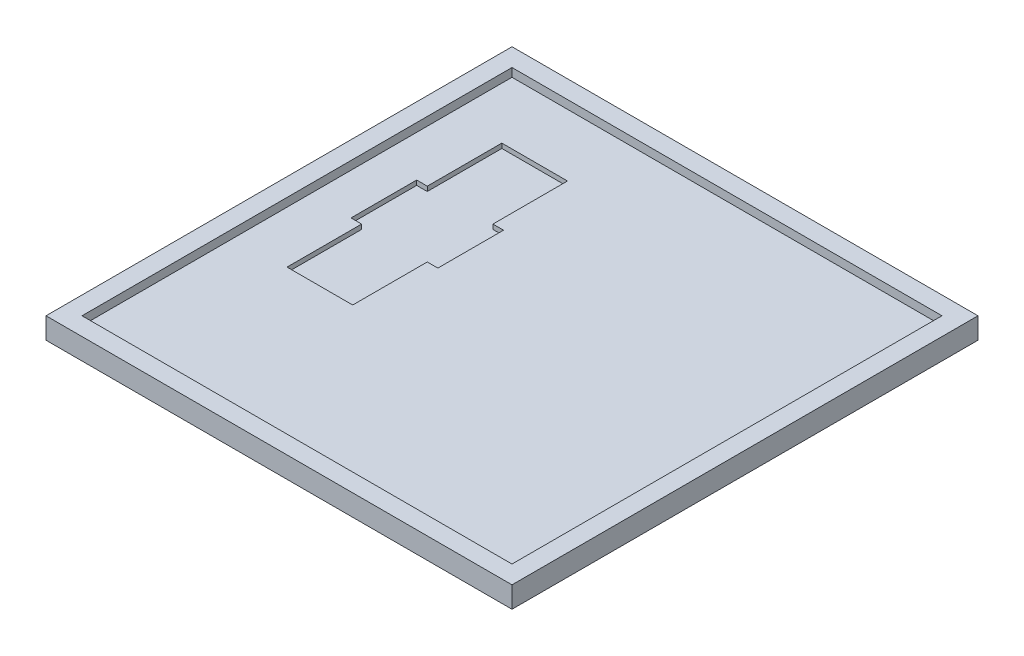
ISO-10303-21;
HEADER;
FILE_DESCRIPTION(('STEP AP214'),'2;1');
FILE_NAME('part.step','',(''),(''),'','','');
FILE_SCHEMA(('AUTOMOTIVE_DESIGN { 1 0 10303 214 1 1 1 1 }'));
ENDSEC;
DATA;
#1=APPLICATION_CONTEXT('core data for automotive mechanical design processes');
#2=APPLICATION_PROTOCOL_DEFINITION('international standard','automotive_design',2000,#1);
#3=PRODUCT_CONTEXT('',#1,'mechanical');
#4=PRODUCT('Part','Part','',(#3));
#5=PRODUCT_RELATED_PRODUCT_CATEGORY('part','',(#4));
#6=PRODUCT_DEFINITION_FORMATION('','',#4);
#7=PRODUCT_DEFINITION_CONTEXT('part definition',#1,'design');
#8=PRODUCT_DEFINITION('design','',#6,#7);
#9=PRODUCT_DEFINITION_SHAPE('','',#8);
#10=(LENGTH_UNIT() NAMED_UNIT(*) SI_UNIT(.MILLI.,.METRE.));
#11=(NAMED_UNIT(*) PLANE_ANGLE_UNIT() SI_UNIT($,.RADIAN.));
#12=(NAMED_UNIT(*) SI_UNIT($,.STERADIAN.) SOLID_ANGLE_UNIT());
#13=UNCERTAINTY_MEASURE_WITH_UNIT(LENGTH_MEASURE(1.E-05),#10,'distance_accuracy_value','');
#14=(GEOMETRIC_REPRESENTATION_CONTEXT(3) GLOBAL_UNCERTAINTY_ASSIGNED_CONTEXT((#13)) GLOBAL_UNIT_ASSIGNED_CONTEXT((#10,
#11,#12)) REPRESENTATION_CONTEXT('',''));
#15=CARTESIAN_POINT('',(0.,0.,0.));
#16=DIRECTION('',(0.,0.,1.));
#17=DIRECTION('',(1.,0.,0.));
#18=AXIS2_PLACEMENT_3D('',#15,#16,#17);
#19=CARTESIAN_POINT('',(-68.8630136986301,5.,-38.3493150684931));
#20=DIRECTION('',(1.,0.,0.));
#21=DIRECTION('',(0.,0.,-1.));
#22=AXIS2_PLACEMENT_3D('',#19,#20,#21);
#23=PLANE('',#22);
#24=DIRECTION('',(0.,0.,1.));
#25=VECTOR('',#24,1.);
#26=CARTESIAN_POINT('',(-68.8630136986301,0.,-38.3493150684931));
#27=LINE('',#26,#25);
#28=CARTESIAN_POINT('',(-68.8630136986301,0.,-38.3493150684931));
#29=VERTEX_POINT('',#28);
#30=CARTESIAN_POINT('',(-68.8630136986301,0.,71.6506849315068));
#31=VERTEX_POINT('',#30);
#32=EDGE_CURVE('E296',#29,#31,#27,.T.);
#33=ORIENTED_EDGE('',*,*,#32,.T.);
#34=DIRECTION('',(0.,-1.,0.));
#35=VECTOR('',#34,1.);
#36=CARTESIAN_POINT('',(-68.8630136986301,5.,71.6506849315068));
#37=LINE('',#36,#35);
#38=CARTESIAN_POINT('',(-68.8630136986301,5.,71.6506849315068));
#39=VERTEX_POINT('',#38);
#40=EDGE_CURVE('E11',#39,#31,#37,.T.);
#41=ORIENTED_EDGE('',*,*,#40,.F.);
#42=DIRECTION('',(0.,0.,1.));
#43=VECTOR('',#42,1.);
#44=CARTESIAN_POINT('',(-68.8630136986301,5.,-38.3493150684931));
#45=LINE('',#44,#43);
#46=CARTESIAN_POINT('',(-68.8630136986301,5.,-38.3493150684931));
#47=VERTEX_POINT('',#46);
#48=EDGE_CURVE('E302',#47,#39,#45,.T.);
#49=ORIENTED_EDGE('',*,*,#48,.F.);
#50=DIRECTION('',(0.,-1.,0.));
#51=VECTOR('',#50,1.);
#52=CARTESIAN_POINT('',(-68.8630136986301,5.,-38.3493150684931));
#53=LINE('',#52,#51);
#54=EDGE_CURVE('E312',#47,#29,#53,.T.);
#55=ORIENTED_EDGE('',*,*,#54,.T.);
#56=EDGE_LOOP('',(#33,#41,#49,#55));
#57=FACE_BOUND('',#56,.T.);
#58=ADVANCED_FACE('F33',(#57),#23,.F.);
#59=CARTESIAN_POINT('',(-68.8630136986301,5.,71.6506849315068));
#60=DIRECTION('',(0.,0.,-1.));
#61=DIRECTION('',(-1.,0.,0.));
#62=AXIS2_PLACEMENT_3D('',#59,#60,#61);
#63=PLANE('',#62);
#64=DIRECTION('',(1.,0.,0.));
#65=VECTOR('',#64,1.);
#66=CARTESIAN_POINT('',(-68.8630136986301,0.,71.6506849315068));
#67=LINE('',#66,#65);
#68=CARTESIAN_POINT('',(41.1369863013699,0.,71.6506849315068));
#69=VERTEX_POINT('',#68);
#70=EDGE_CURVE('E315',#31,#69,#67,.T.);
#71=ORIENTED_EDGE('',*,*,#70,.T.);
#72=DIRECTION('',(0.,-1.,0.));
#73=VECTOR('',#72,1.);
#74=CARTESIAN_POINT('',(41.1369863013699,5.,71.6506849315068));
#75=LINE('',#74,#73);
#76=CARTESIAN_POINT('',(41.1369863013699,5.,71.6506849315068));
#77=VERTEX_POINT('',#76);
#78=EDGE_CURVE('E40',#77,#69,#75,.T.);
#79=ORIENTED_EDGE('',*,*,#78,.F.);
#80=DIRECTION('',(1.,0.,0.));
#81=VECTOR('',#80,1.);
#82=CARTESIAN_POINT('',(-68.8630136986301,5.,71.6506849315068));
#83=LINE('',#82,#81);
#84=EDGE_CURVE('E305',#39,#77,#83,.T.);
#85=ORIENTED_EDGE('',*,*,#84,.F.);
#86=ORIENTED_EDGE('',*,*,#40,.T.);
#87=EDGE_LOOP('',(#71,#79,#85,#86));
#88=FACE_BOUND('',#87,.T.);
#89=ADVANCED_FACE('F345',(#88),#63,.F.);
#90=CARTESIAN_POINT('',(41.1369863013699,5.,-38.3493150684931));
#91=DIRECTION('',(-1.,0.,0.));
#92=DIRECTION('',(0.,0.,1.));
#93=AXIS2_PLACEMENT_3D('',#90,#91,#92);
#94=PLANE('',#93);
#95=DIRECTION('',(0.,0.,-1.));
#96=VECTOR('',#95,1.);
#97=CARTESIAN_POINT('',(41.1369863013699,0.,-38.3493150684931));
#98=LINE('',#97,#96);
#99=CARTESIAN_POINT('',(41.1369863013699,0.,-38.3493150684931));
#100=VERTEX_POINT('',#99);
#101=EDGE_CURVE('E317',#69,#100,#98,.T.);
#102=ORIENTED_EDGE('',*,*,#101,.T.);
#103=DIRECTION('',(0.,-1.,0.));
#104=VECTOR('',#103,1.);
#105=CARTESIAN_POINT('',(41.1369863013699,5.,-38.3493150684931));
#106=LINE('',#105,#104);
#107=CARTESIAN_POINT('',(41.1369863013699,5.,-38.3493150684931));
#108=VERTEX_POINT('',#107);
#109=EDGE_CURVE('E322',#108,#100,#106,.T.);
#110=ORIENTED_EDGE('',*,*,#109,.F.);
#111=DIRECTION('',(0.,0.,-1.));
#112=VECTOR('',#111,1.);
#113=CARTESIAN_POINT('',(41.1369863013699,5.,-38.3493150684931));
#114=LINE('',#113,#112);
#115=EDGE_CURVE('E308',#77,#108,#114,.T.);
#116=ORIENTED_EDGE('',*,*,#115,.F.);
#117=ORIENTED_EDGE('',*,*,#78,.T.);
#118=EDGE_LOOP('',(#102,#110,#116,#117));
#119=FACE_BOUND('',#118,.T.);
#120=ADVANCED_FACE('F329',(#119),#94,.F.);
#121=CARTESIAN_POINT('',(-68.8630136986301,5.,-38.3493150684931));
#122=DIRECTION('',(0.,0.,1.));
#123=DIRECTION('',(1.,0.,0.));
#124=AXIS2_PLACEMENT_3D('',#121,#122,#123);
#125=PLANE('',#124);
#126=DIRECTION('',(-1.,0.,0.));
#127=VECTOR('',#126,1.);
#128=CARTESIAN_POINT('',(-68.8630136986301,0.,-38.3493150684931));
#129=LINE('',#128,#127);
#130=EDGE_CURVE('E306',#100,#29,#129,.T.);
#131=ORIENTED_EDGE('',*,*,#130,.T.);
#132=ORIENTED_EDGE('',*,*,#54,.F.);
#133=DIRECTION('',(-1.,0.,0.));
#134=VECTOR('',#133,1.);
#135=CARTESIAN_POINT('',(-68.8630136986301,5.,-38.3493150684931));
#136=LINE('',#135,#134);
#137=EDGE_CURVE('E310',#108,#47,#136,.T.);
#138=ORIENTED_EDGE('',*,*,#137,.F.);
#139=ORIENTED_EDGE('',*,*,#109,.T.);
#140=EDGE_LOOP('',(#131,#132,#138,#139));
#141=FACE_BOUND('',#140,.T.);
#142=ADVANCED_FACE('F338',(#141),#125,.F.);
#143=CARTESIAN_POINT('',(0.,5.,0.));
#144=DIRECTION('',(0.,1.,0.));
#145=DIRECTION('',(0.,0.,1.));
#146=AXIS2_PLACEMENT_3D('',#143,#144,#145);
#147=PLANE('',#146);
#148=DIRECTION('',(0.,0.,1.));
#149=VECTOR('',#148,1.);
#150=CARTESIAN_POINT('',(-64.6130136986301,5.,-34.0993150684931));
#151=LINE('',#150,#149);
#152=CARTESIAN_POINT('',(-64.6130136986301,5.,-34.0993150684931));
#153=VERTEX_POINT('',#152);
#154=CARTESIAN_POINT('',(-64.6130136986301,5.,67.4006849315068));
#155=VERTEX_POINT('',#154);
#156=EDGE_CURVE('E55',#153,#155,#151,.T.);
#157=ORIENTED_EDGE('',*,*,#156,.F.);
#158=DIRECTION('',(-1.,0.,0.));
#159=VECTOR('',#158,1.);
#160=CARTESIAN_POINT('',(-64.6130136986301,5.,-34.0993150684931));
#161=LINE('',#160,#159);
#162=CARTESIAN_POINT('',(36.8869863013699,5.,-34.0993150684932));
#163=VERTEX_POINT('',#162);
#164=EDGE_CURVE('E275',#163,#153,#161,.T.);
#165=ORIENTED_EDGE('',*,*,#164,.F.);
#166=DIRECTION('',(0.,0.,-1.));
#167=VECTOR('',#166,1.);
#168=CARTESIAN_POINT('',(36.8869863013699,5.,-34.0993150684932));
#169=LINE('',#168,#167);
#170=CARTESIAN_POINT('',(36.8869863013699,5.,67.4006849315068));
#171=VERTEX_POINT('',#170);
#172=EDGE_CURVE('E289',#171,#163,#169,.T.);
#173=ORIENTED_EDGE('',*,*,#172,.F.);
#174=DIRECTION('',(1.,0.,0.));
#175=VECTOR('',#174,1.);
#176=CARTESIAN_POINT('',(-64.6130136986301,5.,67.4006849315068));
#177=LINE('',#176,#175);
#178=EDGE_CURVE('E286',#155,#171,#177,.T.);
#179=ORIENTED_EDGE('',*,*,#178,.F.);
#180=EDGE_LOOP('',(#157,#165,#173,#179));
#181=FACE_BOUND('',#180,.T.);
#182=ORIENTED_EDGE('',*,*,#48,.T.);
#183=ORIENTED_EDGE('',*,*,#84,.T.);
#184=ORIENTED_EDGE('',*,*,#115,.T.);
#185=ORIENTED_EDGE('',*,*,#137,.T.);
#186=EDGE_LOOP('',(#182,#183,#184,#185));
#187=FACE_BOUND('',#186,.T.);
#188=ADVANCED_FACE('F344',(#181,#187),#147,.T.);
#189=CARTESIAN_POINT('',(0.,0.,0.));
#190=DIRECTION('',(0.,1.,0.));
#191=DIRECTION('',(0.,0.,1.));
#192=AXIS2_PLACEMENT_3D('',#189,#190,#191);
#193=PLANE('',#192);
#194=ORIENTED_EDGE('',*,*,#32,.F.);
#195=ORIENTED_EDGE('',*,*,#130,.F.);
#196=ORIENTED_EDGE('',*,*,#101,.F.);
#197=ORIENTED_EDGE('',*,*,#70,.F.);
#198=EDGE_LOOP('',(#194,#195,#196,#197));
#199=FACE_BOUND('',#198,.T.);
#200=ADVANCED_FACE('F335',(#199),#193,.F.);
#201=CARTESIAN_POINT('',(-64.6130136986301,3.,-34.0993150684931));
#202=DIRECTION('',(-1.,0.,0.));
#203=DIRECTION('',(0.,0.,1.));
#204=AXIS2_PLACEMENT_3D('',#201,#202,#203);
#205=PLANE('',#204);
#206=ORIENTED_EDGE('',*,*,#156,.T.);
#207=DIRECTION('',(0.,1.,0.));
#208=VECTOR('',#207,1.);
#209=CARTESIAN_POINT('',(-64.6130136986301,3.,67.4006849315068));
#210=LINE('',#209,#208);
#211=CARTESIAN_POINT('',(-64.6130136986301,3.,67.4006849315068));
#212=VERTEX_POINT('',#211);
#213=EDGE_CURVE('E284',#212,#155,#210,.T.);
#214=ORIENTED_EDGE('',*,*,#213,.F.);
#215=DIRECTION('',(0.,0.,1.));
#216=VECTOR('',#215,1.);
#217=CARTESIAN_POINT('',(-64.6130136986301,3.,-34.0993150684931));
#218=LINE('',#217,#216);
#219=CARTESIAN_POINT('',(-64.6130136986301,3.,-34.0993150684931));
#220=VERTEX_POINT('',#219);
#221=EDGE_CURVE('E271',#220,#212,#218,.T.);
#222=ORIENTED_EDGE('',*,*,#221,.F.);
#223=DIRECTION('',(0.,1.,0.));
#224=VECTOR('',#223,1.);
#225=CARTESIAN_POINT('',(-64.6130136986301,3.,-34.0993150684931));
#226=LINE('',#225,#224);
#227=EDGE_CURVE('E294',#220,#153,#226,.T.);
#228=ORIENTED_EDGE('',*,*,#227,.T.);
#229=EDGE_LOOP('',(#206,#214,#222,#228));
#230=FACE_BOUND('',#229,.T.);
#231=ADVANCED_FACE('F357',(#230),#205,.F.);
#232=CARTESIAN_POINT('',(-64.6130136986301,3.,-34.0993150684931));
#233=DIRECTION('',(0.,0.,-1.));
#234=DIRECTION('',(-1.,0.,0.));
#235=AXIS2_PLACEMENT_3D('',#232,#233,#234);
#236=PLANE('',#235);
#237=ORIENTED_EDGE('',*,*,#164,.T.);
#238=ORIENTED_EDGE('',*,*,#227,.F.);
#239=DIRECTION('',(-1.,0.,0.));
#240=VECTOR('',#239,1.);
#241=CARTESIAN_POINT('',(-64.6130136986301,3.,-34.0993150684931));
#242=LINE('',#241,#240);
#243=CARTESIAN_POINT('',(36.8869863013699,3.,-34.0993150684932));
#244=VERTEX_POINT('',#243);
#245=EDGE_CURVE('E281',#244,#220,#242,.T.);
#246=ORIENTED_EDGE('',*,*,#245,.F.);
#247=DIRECTION('',(0.,1.,0.));
#248=VECTOR('',#247,1.);
#249=CARTESIAN_POINT('',(36.8869863013699,3.,-34.0993150684932));
#250=LINE('',#249,#248);
#251=EDGE_CURVE('E297',#244,#163,#250,.T.);
#252=ORIENTED_EDGE('',*,*,#251,.T.);
#253=EDGE_LOOP('',(#237,#238,#246,#252));
#254=FACE_BOUND('',#253,.T.);
#255=ADVANCED_FACE('F363',(#254),#236,.F.);
#256=CARTESIAN_POINT('',(36.8869863013699,3.,-34.0993150684932));
#257=DIRECTION('',(1.,0.,0.));
#258=DIRECTION('',(0.,0.,-1.));
#259=AXIS2_PLACEMENT_3D('',#256,#257,#258);
#260=PLANE('',#259);
#261=ORIENTED_EDGE('',*,*,#172,.T.);
#262=ORIENTED_EDGE('',*,*,#251,.F.);
#263=DIRECTION('',(0.,0.,-1.));
#264=VECTOR('',#263,1.);
#265=CARTESIAN_POINT('',(36.8869863013699,3.,-34.0993150684932));
#266=LINE('',#265,#264);
#267=CARTESIAN_POINT('',(36.8869863013699,3.,67.4006849315068));
#268=VERTEX_POINT('',#267);
#269=EDGE_CURVE('E278',#268,#244,#266,.T.);
#270=ORIENTED_EDGE('',*,*,#269,.F.);
#271=DIRECTION('',(0.,1.,0.));
#272=VECTOR('',#271,1.);
#273=CARTESIAN_POINT('',(36.8869863013699,3.,67.4006849315068));
#274=LINE('',#273,#272);
#275=EDGE_CURVE('E299',#268,#171,#274,.T.);
#276=ORIENTED_EDGE('',*,*,#275,.T.);
#277=EDGE_LOOP('',(#261,#262,#270,#276));
#278=FACE_BOUND('',#277,.T.);
#279=ADVANCED_FACE('F368',(#278),#260,.F.);
#280=CARTESIAN_POINT('',(-64.6130136986301,3.,67.4006849315068));
#281=DIRECTION('',(0.,0.,1.));
#282=DIRECTION('',(1.,0.,0.));
#283=AXIS2_PLACEMENT_3D('',#280,#281,#282);
#284=PLANE('',#283);
#285=ORIENTED_EDGE('',*,*,#178,.T.);
#286=ORIENTED_EDGE('',*,*,#275,.F.);
#287=DIRECTION('',(1.,0.,0.));
#288=VECTOR('',#287,1.);
#289=CARTESIAN_POINT('',(-64.6130136986301,3.,67.4006849315068));
#290=LINE('',#289,#288);
#291=EDGE_CURVE('E274',#212,#268,#290,.T.);
#292=ORIENTED_EDGE('',*,*,#291,.F.);
#293=ORIENTED_EDGE('',*,*,#213,.T.);
#294=EDGE_LOOP('',(#285,#286,#292,#293));
#295=FACE_BOUND('',#294,.T.);
#296=ADVANCED_FACE('F364',(#295),#284,.F.);
#297=CARTESIAN_POINT('',(0.,3.,0.));
#298=DIRECTION('',(0.,1.,0.));
#299=DIRECTION('',(0.,0.,1.));
#300=AXIS2_PLACEMENT_3D('',#297,#298,#299);
#301=PLANE('',#300);
#302=DIRECTION('',(0.,0.,-1.));
#303=VECTOR('',#302,1.);
#304=CARTESIAN_POINT('',(-34.3630136986301,3.,-1.84931506849316));
#305=LINE('',#304,#303);
#306=CARTESIAN_POINT('',(-34.3630136986301,3.,13.6506849315068));
#307=VERTEX_POINT('',#306);
#308=CARTESIAN_POINT('',(-34.3630136986301,3.,-1.84931506849316));
#309=VERTEX_POINT('',#308);
#310=EDGE_CURVE('E47',#307,#309,#305,.T.);
#311=ORIENTED_EDGE('',*,*,#310,.F.);
#312=DIRECTION('',(1.,0.,0.));
#313=VECTOR('',#312,1.);
#314=CARTESIAN_POINT('',(-34.3630136986301,3.,13.6506849315068));
#315=LINE('',#314,#313);
#316=CARTESIAN_POINT('',(-36.8630136986301,3.,13.6506849315068));
#317=VERTEX_POINT('',#316);
#318=EDGE_CURVE('E190',#317,#307,#315,.T.);
#319=ORIENTED_EDGE('',*,*,#318,.F.);
#320=DIRECTION('',(0.,0.,-1.));
#321=VECTOR('',#320,1.);
#322=CARTESIAN_POINT('',(-36.8630136986301,3.,13.6506849315068));
#323=LINE('',#322,#321);
#324=CARTESIAN_POINT('',(-36.8630136986301,3.,31.2506849315068));
#325=VERTEX_POINT('',#324);
#326=EDGE_CURVE('E193',#325,#317,#323,.T.);
#327=ORIENTED_EDGE('',*,*,#326,.F.);
#328=DIRECTION('',(1.,0.,0.));
#329=VECTOR('',#328,1.);
#330=CARTESIAN_POINT('',(-52.3630136986301,3.,31.2506849315069));
#331=LINE('',#330,#329);
#332=CARTESIAN_POINT('',(-52.3630136986301,3.,31.2506849315069));
#333=VERTEX_POINT('',#332);
#334=EDGE_CURVE('E245',#333,#325,#331,.T.);
#335=ORIENTED_EDGE('',*,*,#334,.F.);
#336=DIRECTION('',(0.,0.,1.));
#337=VECTOR('',#336,1.);
#338=CARTESIAN_POINT('',(-52.3630136986301,3.,13.6506849315068));
#339=LINE('',#338,#337);
#340=CARTESIAN_POINT('',(-52.3630136986301,3.,13.6506849315068));
#341=VERTEX_POINT('',#340);
#342=EDGE_CURVE('E242',#341,#333,#339,.T.);
#343=ORIENTED_EDGE('',*,*,#342,.F.);
#344=DIRECTION('',(1.,0.,0.));
#345=VECTOR('',#344,1.);
#346=CARTESIAN_POINT('',(-52.3630136986301,3.,13.6506849315068));
#347=LINE('',#346,#345);
#348=CARTESIAN_POINT('',(-54.8630136986301,3.,13.6506849315068));
#349=VERTEX_POINT('',#348);
#350=EDGE_CURVE('E239',#349,#341,#347,.T.);
#351=ORIENTED_EDGE('',*,*,#350,.F.);
#352=DIRECTION('',(0.,0.,1.));
#353=VECTOR('',#352,1.);
#354=CARTESIAN_POINT('',(-54.8630136986301,3.,-1.84931506849315));
#355=LINE('',#354,#353);
#356=CARTESIAN_POINT('',(-54.8630136986301,3.,-1.84931506849315));
#357=VERTEX_POINT('',#356);
#358=EDGE_CURVE('E236',#357,#349,#355,.T.);
#359=ORIENTED_EDGE('',*,*,#358,.F.);
#360=DIRECTION('',(-1.,0.,0.));
#361=VECTOR('',#360,1.);
#362=CARTESIAN_POINT('',(-52.3630136986301,3.,-1.84931506849315));
#363=LINE('',#362,#361);
#364=CARTESIAN_POINT('',(-52.3630136986301,3.,-1.84931506849315));
#365=VERTEX_POINT('',#364);
#366=EDGE_CURVE('E233',#365,#357,#363,.T.);
#367=ORIENTED_EDGE('',*,*,#366,.F.);
#368=DIRECTION('',(0.,0.,1.));
#369=VECTOR('',#368,1.);
#370=CARTESIAN_POINT('',(-52.3630136986301,3.,-19.4493150684931));
#371=LINE('',#370,#369);
#372=CARTESIAN_POINT('',(-52.3630136986301,3.,-19.4493150684931));
#373=VERTEX_POINT('',#372);
#374=EDGE_CURVE('E230',#373,#365,#371,.T.);
#375=ORIENTED_EDGE('',*,*,#374,.F.);
#376=DIRECTION('',(-1.,0.,0.));
#377=VECTOR('',#376,1.);
#378=CARTESIAN_POINT('',(-52.3630136986301,3.,-19.4493150684931));
#379=LINE('',#378,#377);
#380=CARTESIAN_POINT('',(-36.8630136986301,3.,-19.4493150684931));
#381=VERTEX_POINT('',#380);
#382=EDGE_CURVE('E227',#381,#373,#379,.T.);
#383=ORIENTED_EDGE('',*,*,#382,.F.);
#384=DIRECTION('',(0.,0.,-1.));
#385=VECTOR('',#384,1.);
#386=CARTESIAN_POINT('',(-36.8630136986301,3.,-19.4493150684931));
#387=LINE('',#386,#385);
#388=CARTESIAN_POINT('',(-36.8630136986301,3.,-1.84931506849316));
#389=VERTEX_POINT('',#388);
#390=EDGE_CURVE('E224',#389,#381,#387,.T.);
#391=ORIENTED_EDGE('',*,*,#390,.F.);
#392=DIRECTION('',(-1.,0.,0.));
#393=VECTOR('',#392,1.);
#394=CARTESIAN_POINT('',(-34.3630136986301,3.,-1.84931506849316));
#395=LINE('',#394,#393);
#396=EDGE_CURVE('E222',#309,#389,#395,.T.);
#397=ORIENTED_EDGE('',*,*,#396,.F.);
#398=EDGE_LOOP('',(#311,#319,#327,#335,#343,#351,#359,#367,#375,#383,#391,#397));
#399=FACE_BOUND('',#398,.T.);
#400=ORIENTED_EDGE('',*,*,#221,.T.);
#401=ORIENTED_EDGE('',*,*,#291,.T.);
#402=ORIENTED_EDGE('',*,*,#269,.T.);
#403=ORIENTED_EDGE('',*,*,#245,.T.);
#404=EDGE_LOOP('',(#400,#401,#402,#403));
#405=FACE_BOUND('',#404,.T.);
#406=ADVANCED_FACE('F367',(#399,#405),#301,.T.);
#407=CARTESIAN_POINT('',(-34.3630136986301,1.9,-1.84931506849316));
#408=DIRECTION('',(1.,0.,0.));
#409=DIRECTION('',(0.,0.,-1.));
#410=AXIS2_PLACEMENT_3D('',#407,#408,#409);
#411=PLANE('',#410);
#412=ORIENTED_EDGE('',*,*,#310,.T.);
#413=DIRECTION('',(0.,1.,0.));
#414=VECTOR('',#413,1.);
#415=CARTESIAN_POINT('',(-34.3630136986301,1.9,-1.84931506849316));
#416=LINE('',#415,#414);
#417=CARTESIAN_POINT('',(-34.3630136986301,1.9,-1.84931506849316));
#418=VERTEX_POINT('',#417);
#419=EDGE_CURVE('E167',#418,#309,#416,.T.);
#420=ORIENTED_EDGE('',*,*,#419,.F.);
#421=DIRECTION('',(0.,0.,-1.));
#422=VECTOR('',#421,1.);
#423=CARTESIAN_POINT('',(-34.3630136986301,1.9,-1.84931506849316));
#424=LINE('',#423,#422);
#425=CARTESIAN_POINT('',(-34.3630136986301,1.9,13.6506849315068));
#426=VERTEX_POINT('',#425);
#427=EDGE_CURVE('E171',#426,#418,#424,.T.);
#428=ORIENTED_EDGE('',*,*,#427,.F.);
#429=DIRECTION('',(0.,1.,0.));
#430=VECTOR('',#429,1.);
#431=CARTESIAN_POINT('',(-34.3630136986301,1.9,13.6506849315068));
#432=LINE('',#431,#430);
#433=EDGE_CURVE('E250',#426,#307,#432,.T.);
#434=ORIENTED_EDGE('',*,*,#433,.T.);
#435=EDGE_LOOP('',(#412,#420,#428,#434));
#436=FACE_BOUND('',#435,.T.);
#437=ADVANCED_FACE('F169',(#436),#411,.F.);
#438=CARTESIAN_POINT('',(-34.3630136986301,1.9,13.6506849315068));
#439=DIRECTION('',(0.,0.,1.));
#440=DIRECTION('',(1.,0.,0.));
#441=AXIS2_PLACEMENT_3D('',#438,#439,#440);
#442=PLANE('',#441);
#443=ORIENTED_EDGE('',*,*,#318,.T.);
#444=ORIENTED_EDGE('',*,*,#433,.F.);
#445=DIRECTION('',(1.,0.,0.));
#446=VECTOR('',#445,1.);
#447=CARTESIAN_POINT('',(-34.3630136986301,1.9,13.6506849315068));
#448=LINE('',#447,#446);
#449=CARTESIAN_POINT('',(-36.8630136986301,1.9,13.6506849315068));
#450=VERTEX_POINT('',#449);
#451=EDGE_CURVE('E177',#450,#426,#448,.T.);
#452=ORIENTED_EDGE('',*,*,#451,.F.);
#453=DIRECTION('',(0.,1.,0.));
#454=VECTOR('',#453,1.);
#455=CARTESIAN_POINT('',(-36.8630136986301,1.9,13.6506849315068));
#456=LINE('',#455,#454);
#457=EDGE_CURVE('E252',#450,#317,#456,.T.);
#458=ORIENTED_EDGE('',*,*,#457,.T.);
#459=EDGE_LOOP('',(#443,#444,#452,#458));
#460=FACE_BOUND('',#459,.T.);
#461=ADVANCED_FACE('F381',(#460),#442,.F.);
#462=CARTESIAN_POINT('',(-36.8630136986301,1.9,13.6506849315068));
#463=DIRECTION('',(1.,0.,0.));
#464=DIRECTION('',(0.,0.,-1.));
#465=AXIS2_PLACEMENT_3D('',#462,#463,#464);
#466=PLANE('',#465);
#467=ORIENTED_EDGE('',*,*,#326,.T.);
#468=ORIENTED_EDGE('',*,*,#457,.F.);
#469=DIRECTION('',(0.,0.,-1.));
#470=VECTOR('',#469,1.);
#471=CARTESIAN_POINT('',(-36.8630136986301,1.9,13.6506849315068));
#472=LINE('',#471,#470);
#473=CARTESIAN_POINT('',(-36.8630136986301,1.9,31.2506849315068));
#474=VERTEX_POINT('',#473);
#475=EDGE_CURVE('E218',#474,#450,#472,.T.);
#476=ORIENTED_EDGE('',*,*,#475,.F.);
#477=DIRECTION('',(0.,1.,0.));
#478=VECTOR('',#477,1.);
#479=CARTESIAN_POINT('',(-36.8630136986301,1.9,31.2506849315068));
#480=LINE('',#479,#478);
#481=EDGE_CURVE('E254',#474,#325,#480,.T.);
#482=ORIENTED_EDGE('',*,*,#481,.T.);
#483=EDGE_LOOP('',(#467,#468,#476,#482));
#484=FACE_BOUND('',#483,.T.);
#485=ADVANCED_FACE('F415',(#484),#466,.F.);
#486=CARTESIAN_POINT('',(-52.3630136986301,1.9,31.2506849315069));
#487=DIRECTION('',(0.,0.,1.));
#488=DIRECTION('',(1.,0.,0.));
#489=AXIS2_PLACEMENT_3D('',#486,#487,#488);
#490=PLANE('',#489);
#491=ORIENTED_EDGE('',*,*,#334,.T.);
#492=ORIENTED_EDGE('',*,*,#481,.F.);
#493=DIRECTION('',(1.,0.,0.));
#494=VECTOR('',#493,1.);
#495=CARTESIAN_POINT('',(-52.3630136986301,1.9,31.2506849315069));
#496=LINE('',#495,#494);
#497=CARTESIAN_POINT('',(-52.3630136986301,1.9,31.2506849315069));
#498=VERTEX_POINT('',#497);
#499=EDGE_CURVE('E215',#498,#474,#496,.T.);
#500=ORIENTED_EDGE('',*,*,#499,.F.);
#501=DIRECTION('',(0.,1.,0.));
#502=VECTOR('',#501,1.);
#503=CARTESIAN_POINT('',(-52.3630136986301,1.9,31.2506849315069));
#504=LINE('',#503,#502);
#505=EDGE_CURVE('E256',#498,#333,#504,.T.);
#506=ORIENTED_EDGE('',*,*,#505,.T.);
#507=EDGE_LOOP('',(#491,#492,#500,#506));
#508=FACE_BOUND('',#507,.T.);
#509=ADVANCED_FACE('F411',(#508),#490,.F.);
#510=CARTESIAN_POINT('',(-52.3630136986301,1.9,13.6506849315068));
#511=DIRECTION('',(-1.,0.,0.));
#512=DIRECTION('',(0.,0.,1.));
#513=AXIS2_PLACEMENT_3D('',#510,#511,#512);
#514=PLANE('',#513);
#515=ORIENTED_EDGE('',*,*,#342,.T.);
#516=ORIENTED_EDGE('',*,*,#505,.F.);
#517=DIRECTION('',(0.,0.,1.));
#518=VECTOR('',#517,1.);
#519=CARTESIAN_POINT('',(-52.3630136986301,1.9,13.6506849315068));
#520=LINE('',#519,#518);
#521=CARTESIAN_POINT('',(-52.3630136986301,1.9,13.6506849315068));
#522=VERTEX_POINT('',#521);
#523=EDGE_CURVE('E212',#522,#498,#520,.T.);
#524=ORIENTED_EDGE('',*,*,#523,.F.);
#525=DIRECTION('',(0.,1.,0.));
#526=VECTOR('',#525,1.);
#527=CARTESIAN_POINT('',(-52.3630136986301,1.9,13.6506849315068));
#528=LINE('',#527,#526);
#529=EDGE_CURVE('E258',#522,#341,#528,.T.);
#530=ORIENTED_EDGE('',*,*,#529,.T.);
#531=EDGE_LOOP('',(#515,#516,#524,#530));
#532=FACE_BOUND('',#531,.T.);
#533=ADVANCED_FACE('F407',(#532),#514,.F.);
#534=CARTESIAN_POINT('',(-52.3630136986301,1.9,13.6506849315068));
#535=DIRECTION('',(0.,0.,1.));
#536=DIRECTION('',(1.,0.,0.));
#537=AXIS2_PLACEMENT_3D('',#534,#535,#536);
#538=PLANE('',#537);
#539=ORIENTED_EDGE('',*,*,#350,.T.);
#540=ORIENTED_EDGE('',*,*,#529,.F.);
#541=DIRECTION('',(1.,0.,0.));
#542=VECTOR('',#541,1.);
#543=CARTESIAN_POINT('',(-52.3630136986301,1.9,13.6506849315068));
#544=LINE('',#543,#542);
#545=CARTESIAN_POINT('',(-54.8630136986301,1.9,13.6506849315068));
#546=VERTEX_POINT('',#545);
#547=EDGE_CURVE('E209',#546,#522,#544,.T.);
#548=ORIENTED_EDGE('',*,*,#547,.F.);
#549=DIRECTION('',(0.,1.,0.));
#550=VECTOR('',#549,1.);
#551=CARTESIAN_POINT('',(-54.8630136986301,1.9,13.6506849315068));
#552=LINE('',#551,#550);
#553=EDGE_CURVE('E260',#546,#349,#552,.T.);
#554=ORIENTED_EDGE('',*,*,#553,.T.);
#555=EDGE_LOOP('',(#539,#540,#548,#554));
#556=FACE_BOUND('',#555,.T.);
#557=ADVANCED_FACE('F403',(#556),#538,.F.);
#558=CARTESIAN_POINT('',(-54.8630136986301,1.9,-1.84931506849315));
#559=DIRECTION('',(-1.,0.,0.));
#560=DIRECTION('',(0.,0.,1.));
#561=AXIS2_PLACEMENT_3D('',#558,#559,#560);
#562=PLANE('',#561);
#563=ORIENTED_EDGE('',*,*,#358,.T.);
#564=ORIENTED_EDGE('',*,*,#553,.F.);
#565=DIRECTION('',(0.,0.,1.));
#566=VECTOR('',#565,1.);
#567=CARTESIAN_POINT('',(-54.8630136986301,1.9,-1.84931506849315));
#568=LINE('',#567,#566);
#569=CARTESIAN_POINT('',(-54.8630136986301,1.9,-1.84931506849315));
#570=VERTEX_POINT('',#569);
#571=EDGE_CURVE('E206',#570,#546,#568,.T.);
#572=ORIENTED_EDGE('',*,*,#571,.F.);
#573=DIRECTION('',(0.,1.,0.));
#574=VECTOR('',#573,1.);
#575=CARTESIAN_POINT('',(-54.8630136986301,1.9,-1.84931506849315));
#576=LINE('',#575,#574);
#577=EDGE_CURVE('E262',#570,#357,#576,.T.);
#578=ORIENTED_EDGE('',*,*,#577,.T.);
#579=EDGE_LOOP('',(#563,#564,#572,#578));
#580=FACE_BOUND('',#579,.T.);
#581=ADVANCED_FACE('F399',(#580),#562,.F.);
#582=CARTESIAN_POINT('',(-52.3630136986301,1.9,-1.84931506849315));
#583=DIRECTION('',(0.,0.,-1.));
#584=DIRECTION('',(-1.,0.,0.));
#585=AXIS2_PLACEMENT_3D('',#582,#583,#584);
#586=PLANE('',#585);
#587=ORIENTED_EDGE('',*,*,#366,.T.);
#588=ORIENTED_EDGE('',*,*,#577,.F.);
#589=DIRECTION('',(-1.,0.,0.));
#590=VECTOR('',#589,1.);
#591=CARTESIAN_POINT('',(-52.3630136986301,1.9,-1.84931506849315));
#592=LINE('',#591,#590);
#593=CARTESIAN_POINT('',(-52.3630136986301,1.9,-1.84931506849315));
#594=VERTEX_POINT('',#593);
#595=EDGE_CURVE('E203',#594,#570,#592,.T.);
#596=ORIENTED_EDGE('',*,*,#595,.F.);
#597=DIRECTION('',(0.,1.,0.));
#598=VECTOR('',#597,1.);
#599=CARTESIAN_POINT('',(-52.3630136986301,1.9,-1.84931506849315));
#600=LINE('',#599,#598);
#601=EDGE_CURVE('E264',#594,#365,#600,.T.);
#602=ORIENTED_EDGE('',*,*,#601,.T.);
#603=EDGE_LOOP('',(#587,#588,#596,#602));
#604=FACE_BOUND('',#603,.T.);
#605=ADVANCED_FACE('F395',(#604),#586,.F.);
#606=CARTESIAN_POINT('',(-52.3630136986301,1.9,-19.4493150684931));
#607=DIRECTION('',(-1.,0.,0.));
#608=DIRECTION('',(0.,0.,1.));
#609=AXIS2_PLACEMENT_3D('',#606,#607,#608);
#610=PLANE('',#609);
#611=ORIENTED_EDGE('',*,*,#374,.T.);
#612=ORIENTED_EDGE('',*,*,#601,.F.);
#613=DIRECTION('',(0.,0.,1.));
#614=VECTOR('',#613,1.);
#615=CARTESIAN_POINT('',(-52.3630136986301,1.9,-19.4493150684931));
#616=LINE('',#615,#614);
#617=CARTESIAN_POINT('',(-52.3630136986301,1.9,-19.4493150684931));
#618=VERTEX_POINT('',#617);
#619=EDGE_CURVE('E200',#618,#594,#616,.T.);
#620=ORIENTED_EDGE('',*,*,#619,.F.);
#621=DIRECTION('',(0.,1.,0.));
#622=VECTOR('',#621,1.);
#623=CARTESIAN_POINT('',(-52.3630136986301,1.9,-19.4493150684931));
#624=LINE('',#623,#622);
#625=EDGE_CURVE('E266',#618,#373,#624,.T.);
#626=ORIENTED_EDGE('',*,*,#625,.T.);
#627=EDGE_LOOP('',(#611,#612,#620,#626));
#628=FACE_BOUND('',#627,.T.);
#629=ADVANCED_FACE('F391',(#628),#610,.F.);
#630=CARTESIAN_POINT('',(-52.3630136986301,1.9,-19.4493150684931));
#631=DIRECTION('',(0.,0.,-1.));
#632=DIRECTION('',(-1.,0.,0.));
#633=AXIS2_PLACEMENT_3D('',#630,#631,#632);
#634=PLANE('',#633);
#635=ORIENTED_EDGE('',*,*,#382,.T.);
#636=ORIENTED_EDGE('',*,*,#625,.F.);
#637=DIRECTION('',(-1.,0.,0.));
#638=VECTOR('',#637,1.);
#639=CARTESIAN_POINT('',(-52.3630136986301,1.9,-19.4493150684931));
#640=LINE('',#639,#638);
#641=CARTESIAN_POINT('',(-36.8630136986301,1.9,-19.4493150684931));
#642=VERTEX_POINT('',#641);
#643=EDGE_CURVE('E197',#642,#618,#640,.T.);
#644=ORIENTED_EDGE('',*,*,#643,.F.);
#645=DIRECTION('',(0.,1.,0.));
#646=VECTOR('',#645,1.);
#647=CARTESIAN_POINT('',(-36.8630136986301,1.9,-19.4493150684931));
#648=LINE('',#647,#646);
#649=EDGE_CURVE('E268',#642,#381,#648,.T.);
#650=ORIENTED_EDGE('',*,*,#649,.T.);
#651=EDGE_LOOP('',(#635,#636,#644,#650));
#652=FACE_BOUND('',#651,.T.);
#653=ADVANCED_FACE('F387',(#652),#634,.F.);
#654=CARTESIAN_POINT('',(-36.8630136986301,1.9,-19.4493150684931));
#655=DIRECTION('',(1.,0.,0.));
#656=DIRECTION('',(0.,0.,-1.));
#657=AXIS2_PLACEMENT_3D('',#654,#655,#656);
#658=PLANE('',#657);
#659=ORIENTED_EDGE('',*,*,#390,.T.);
#660=ORIENTED_EDGE('',*,*,#649,.F.);
#661=DIRECTION('',(0.,0.,-1.));
#662=VECTOR('',#661,1.);
#663=CARTESIAN_POINT('',(-36.8630136986301,1.9,-19.4493150684931));
#664=LINE('',#663,#662);
#665=CARTESIAN_POINT('',(-36.8630136986301,1.9,-1.84931506849316));
#666=VERTEX_POINT('',#665);
#667=EDGE_CURVE('E185',#666,#642,#664,.T.);
#668=ORIENTED_EDGE('',*,*,#667,.F.);
#669=DIRECTION('',(0.,1.,0.));
#670=VECTOR('',#669,1.);
#671=CARTESIAN_POINT('',(-36.8630136986301,1.9,-1.84931506849316));
#672=LINE('',#671,#670);
#673=EDGE_CURVE('E176',#666,#389,#672,.T.);
#674=ORIENTED_EDGE('',*,*,#673,.T.);
#675=EDGE_LOOP('',(#659,#660,#668,#674));
#676=FACE_BOUND('',#675,.T.);
#677=ADVANCED_FACE('F384',(#676),#658,.F.);
#678=CARTESIAN_POINT('',(-34.3630136986301,1.9,-1.84931506849316));
#679=DIRECTION('',(0.,0.,-1.));
#680=DIRECTION('',(-1.,0.,0.));
#681=AXIS2_PLACEMENT_3D('',#678,#679,#680);
#682=PLANE('',#681);
#683=ORIENTED_EDGE('',*,*,#396,.T.);
#684=ORIENTED_EDGE('',*,*,#673,.F.);
#685=DIRECTION('',(-1.,0.,0.));
#686=VECTOR('',#685,1.);
#687=CARTESIAN_POINT('',(-34.3630136986301,1.9,-1.84931506849316));
#688=LINE('',#687,#686);
#689=EDGE_CURVE('E180',#418,#666,#688,.T.);
#690=ORIENTED_EDGE('',*,*,#689,.F.);
#691=ORIENTED_EDGE('',*,*,#419,.T.);
#692=EDGE_LOOP('',(#683,#684,#690,#691));
#693=FACE_BOUND('',#692,.T.);
#694=ADVANCED_FACE('F181',(#693),#682,.F.);
#695=CARTESIAN_POINT('',(0.,1.9,0.));
#696=DIRECTION('',(0.,-1.,0.));
#697=DIRECTION('',(0.,0.,-1.));
#698=AXIS2_PLACEMENT_3D('',#695,#696,#697);
#699=PLANE('',#698);
#700=ORIENTED_EDGE('',*,*,#427,.T.);
#701=ORIENTED_EDGE('',*,*,#689,.T.);
#702=ORIENTED_EDGE('',*,*,#667,.T.);
#703=ORIENTED_EDGE('',*,*,#643,.T.);
#704=ORIENTED_EDGE('',*,*,#619,.T.);
#705=ORIENTED_EDGE('',*,*,#595,.T.);
#706=ORIENTED_EDGE('',*,*,#571,.T.);
#707=ORIENTED_EDGE('',*,*,#547,.T.);
#708=ORIENTED_EDGE('',*,*,#523,.T.);
#709=ORIENTED_EDGE('',*,*,#499,.T.);
#710=ORIENTED_EDGE('',*,*,#475,.T.);
#711=ORIENTED_EDGE('',*,*,#451,.T.);
#712=EDGE_LOOP('',(#700,#701,#702,#703,#704,#705,#706,#707,#708,#709,#710,#711));
#713=FACE_BOUND('',#712,.T.);
#714=ADVANCED_FACE('F187',(#713),#699,.F.);
#715=CLOSED_SHELL('',(#58,#89,#120,#142,#188,#200,#231,#255,#279,#296,#406,#437,#461,#485,#509,
#533,#557,#581,#605,#629,#653,#677,#694,#714));
#716=MANIFOLD_SOLID_BREP('B2',#715);
#717=ADVANCED_BREP_SHAPE_REPRESENTATION('',(#18,#716),#14);
#718=SHAPE_DEFINITION_REPRESENTATION(#9,#717);
ENDSEC;
END-ISO-10303-21;
